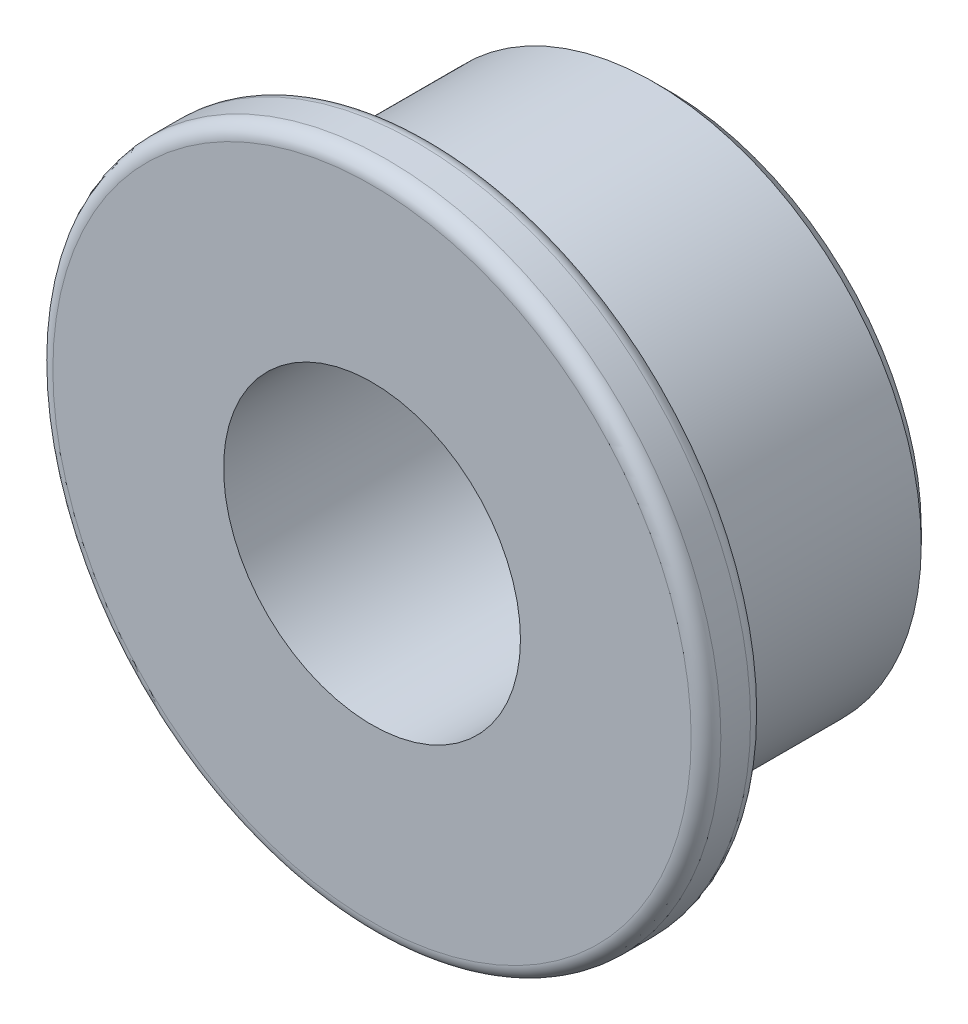
ISO-10303-21;
HEADER;
FILE_DESCRIPTION(('STEP AP214'),'2;1');
FILE_NAME('part.step','',(''),(''),'','','');
FILE_SCHEMA(('AUTOMOTIVE_DESIGN { 1 0 10303 214 1 1 1 1 }'));
ENDSEC;
DATA;
#1=APPLICATION_CONTEXT('core data for automotive mechanical design processes');
#2=APPLICATION_PROTOCOL_DEFINITION('international standard','automotive_design',2000,#1);
#3=PRODUCT_CONTEXT('',#1,'mechanical');
#4=PRODUCT('Part','Part','',(#3));
#5=PRODUCT_RELATED_PRODUCT_CATEGORY('part','',(#4));
#6=PRODUCT_DEFINITION_FORMATION('','',#4);
#7=PRODUCT_DEFINITION_CONTEXT('part definition',#1,'design');
#8=PRODUCT_DEFINITION('design','',#6,#7);
#9=PRODUCT_DEFINITION_SHAPE('','',#8);
#10=(LENGTH_UNIT() NAMED_UNIT(*) SI_UNIT(.MILLI.,.METRE.));
#11=(NAMED_UNIT(*) PLANE_ANGLE_UNIT() SI_UNIT($,.RADIAN.));
#12=(NAMED_UNIT(*) SI_UNIT($,.STERADIAN.) SOLID_ANGLE_UNIT());
#13=UNCERTAINTY_MEASURE_WITH_UNIT(LENGTH_MEASURE(1.E-05),#10,'distance_accuracy_value','');
#14=(GEOMETRIC_REPRESENTATION_CONTEXT(3) GLOBAL_UNCERTAINTY_ASSIGNED_CONTEXT((#13)) GLOBAL_UNIT_ASSIGNED_CONTEXT((#10,
#11,#12)) REPRESENTATION_CONTEXT('',''));
#15=CARTESIAN_POINT('',(0.,0.,0.));
#16=DIRECTION('',(0.,0.,1.));
#17=DIRECTION('',(1.,0.,0.));
#18=AXIS2_PLACEMENT_3D('',#15,#16,#17);
#19=CARTESIAN_POINT('',(0.,0.,-8.));
#20=DIRECTION('',(0.,0.,1.));
#21=DIRECTION('',(1.,0.,0.));
#22=AXIS2_PLACEMENT_3D('',#19,#20,#21);
#23=CYLINDRICAL_SURFACE('',#22,9.);
#24=CARTESIAN_POINT('',(0.,0.,-7.49999999999999));
#25=DIRECTION('',(0.,0.,1.));
#26=DIRECTION('',(1.,0.,0.));
#27=AXIS2_PLACEMENT_3D('',#24,#25,#26);
#28=CIRCLE('',#27,9.);
#29=CARTESIAN_POINT('',(9.,0.,-7.49999999999999));
#30=VERTEX_POINT('',#29);
#31=EDGE_CURVE('E54',#30,#30,#28,.T.);
#32=ORIENTED_EDGE('',*,*,#31,.T.);
#33=EDGE_LOOP('',(#32));
#34=FACE_BOUND('',#33,.T.);
#35=CARTESIAN_POINT('',(0.,0.,-0.8));
#36=DIRECTION('',(0.,0.,1.));
#37=DIRECTION('',(1.,0.,0.));
#38=AXIS2_PLACEMENT_3D('',#35,#36,#37);
#39=CIRCLE('',#38,9.);
#40=CARTESIAN_POINT('',(9.,0.,-0.8));
#41=VERTEX_POINT('',#40);
#42=EDGE_CURVE('E59',#41,#41,#39,.F.);
#43=ORIENTED_EDGE('',*,*,#42,.T.);
#44=EDGE_LOOP('',(#43));
#45=FACE_BOUND('',#44,.T.);
#46=ADVANCED_FACE('F45',(#34,#45),#23,.T.);
#47=CARTESIAN_POINT('',(0.,0.,-8.));
#48=DIRECTION('',(0.,0.,1.));
#49=DIRECTION('',(1.,0.,0.));
#50=AXIS2_PLACEMENT_3D('',#47,#48,#49);
#51=PLANE('',#50);
#52=CARTESIAN_POINT('',(0.,0.,-8.));
#53=DIRECTION('',(0.,0.,1.));
#54=DIRECTION('',(1.,0.,0.));
#55=AXIS2_PLACEMENT_3D('',#52,#53,#54);
#56=CIRCLE('',#55,8.49999999999999);
#57=CARTESIAN_POINT('',(8.49999999999999,0.,-8.));
#58=VERTEX_POINT('',#57);
#59=EDGE_CURVE('E10',#58,#58,#56,.F.);
#60=ORIENTED_EDGE('',*,*,#59,.T.);
#61=EDGE_LOOP('',(#60));
#62=FACE_BOUND('',#61,.T.);
#63=CARTESIAN_POINT('',(0.,0.,-8.));
#64=DIRECTION('',(0.,0.,1.));
#65=DIRECTION('',(1.,0.,0.));
#66=AXIS2_PLACEMENT_3D('',#63,#64,#65);
#67=CIRCLE('',#66,5.);
#68=CARTESIAN_POINT('',(5.,0.,-8.));
#69=VERTEX_POINT('',#68);
#70=EDGE_CURVE('E86',#69,#69,#67,.T.);
#71=ORIENTED_EDGE('',*,*,#70,.T.);
#72=EDGE_LOOP('',(#71));
#73=FACE_BOUND('',#72,.T.);
#74=ADVANCED_FACE('F110',(#62,#73),#51,.F.);
#75=CARTESIAN_POINT('',(0.,0.,-8.));
#76=DIRECTION('',(0.,0.,1.));
#77=DIRECTION('',(1.,0.,0.));
#78=AXIS2_PLACEMENT_3D('',#75,#76,#77);
#79=CYLINDRICAL_SURFACE('',#78,5.);
#80=ORIENTED_EDGE('',*,*,#70,.F.);
#81=EDGE_LOOP('',(#80));
#82=FACE_BOUND('',#81,.T.);
#83=CARTESIAN_POINT('',(0.,0.,2.));
#84=DIRECTION('',(0.,0.,1.));
#85=DIRECTION('',(1.,0.,0.));
#86=AXIS2_PLACEMENT_3D('',#83,#84,#85);
#87=CIRCLE('',#86,5.);
#88=CARTESIAN_POINT('',(5.,0.,2.));
#89=VERTEX_POINT('',#88);
#90=EDGE_CURVE('E90',#89,#89,#87,.T.);
#91=ORIENTED_EDGE('',*,*,#90,.T.);
#92=EDGE_LOOP('',(#91));
#93=FACE_BOUND('',#92,.T.);
#94=ADVANCED_FACE('F95',(#82,#93),#79,.F.);
#95=CARTESIAN_POINT('',(0.,0.,2.));
#96=DIRECTION('',(0.,0.,1.));
#97=DIRECTION('',(1.,0.,0.));
#98=AXIS2_PLACEMENT_3D('',#95,#96,#97);
#99=PLANE('',#98);
#100=CARTESIAN_POINT('',(0.,0.,2.));
#101=DIRECTION('',(0.,0.,1.));
#102=DIRECTION('',(1.,0.,0.));
#103=AXIS2_PLACEMENT_3D('',#100,#101,#102);
#104=CIRCLE('',#103,10.75);
#105=CARTESIAN_POINT('',(10.75,0.,2.));
#106=VERTEX_POINT('',#105);
#107=EDGE_CURVE('E82',#106,#106,#104,.T.);
#108=ORIENTED_EDGE('',*,*,#107,.T.);
#109=EDGE_LOOP('',(#108));
#110=FACE_BOUND('',#109,.T.);
#111=ORIENTED_EDGE('',*,*,#90,.F.);
#112=EDGE_LOOP('',(#111));
#113=FACE_BOUND('',#112,.T.);
#114=ADVANCED_FACE('F97',(#110,#113),#99,.T.);
#115=CARTESIAN_POINT('',(0.,0.,0.));
#116=DIRECTION('',(0.,0.,1.));
#117=DIRECTION('',(1.,0.,0.));
#118=AXIS2_PLACEMENT_3D('',#115,#116,#117);
#119=PLANE('',#118);
#120=CARTESIAN_POINT('',(0.,0.,0.));
#121=DIRECTION('',(0.,0.,1.));
#122=DIRECTION('',(1.,0.,0.));
#123=AXIS2_PLACEMENT_3D('',#120,#121,#122);
#124=CIRCLE('',#123,9.8);
#125=CARTESIAN_POINT('',(9.8,0.,0.));
#126=VERTEX_POINT('',#125);
#127=EDGE_CURVE('E64',#126,#126,#124,.T.);
#128=ORIENTED_EDGE('',*,*,#127,.T.);
#129=EDGE_LOOP('',(#128));
#130=FACE_BOUND('',#129,.T.);
#131=CARTESIAN_POINT('',(0.,0.,0.));
#132=DIRECTION('',(0.,0.,1.));
#133=DIRECTION('',(1.,0.,0.));
#134=AXIS2_PLACEMENT_3D('',#131,#132,#133);
#135=CIRCLE('',#134,10.75);
#136=CARTESIAN_POINT('',(10.75,0.,0.));
#137=VERTEX_POINT('',#136);
#138=EDGE_CURVE('E70',#137,#137,#135,.F.);
#139=ORIENTED_EDGE('',*,*,#138,.T.);
#140=EDGE_LOOP('',(#139));
#141=FACE_BOUND('',#140,.T.);
#142=ADVANCED_FACE('F99',(#130,#141),#119,.F.);
#143=CARTESIAN_POINT('',(0.,0.,2.));
#144=DIRECTION('',(0.,0.,-1.));
#145=DIRECTION('',(-1.,0.,0.));
#146=AXIS2_PLACEMENT_3D('',#143,#144,#145);
#147=CYLINDRICAL_SURFACE('',#146,11.25);
#148=CARTESIAN_POINT('',(0.,0.,0.5));
#149=DIRECTION('',(0.,0.,1.));
#150=DIRECTION('',(1.,0.,0.));
#151=AXIS2_PLACEMENT_3D('',#148,#149,#150);
#152=CIRCLE('',#151,11.25);
#153=CARTESIAN_POINT('',(11.25,0.,0.5));
#154=VERTEX_POINT('',#153);
#155=EDGE_CURVE('E74',#154,#154,#152,.T.);
#156=ORIENTED_EDGE('',*,*,#155,.T.);
#157=EDGE_LOOP('',(#156));
#158=FACE_BOUND('',#157,.T.);
#159=CARTESIAN_POINT('',(0.,0.,1.5));
#160=DIRECTION('',(0.,0.,1.));
#161=DIRECTION('',(1.,0.,0.));
#162=AXIS2_PLACEMENT_3D('',#159,#160,#161);
#163=CIRCLE('',#162,11.25);
#164=CARTESIAN_POINT('',(11.25,0.,1.5));
#165=VERTEX_POINT('',#164);
#166=EDGE_CURVE('E78',#165,#165,#163,.F.);
#167=ORIENTED_EDGE('',*,*,#166,.T.);
#168=EDGE_LOOP('',(#167));
#169=FACE_BOUND('',#168,.T.);
#170=ADVANCED_FACE('F107',(#158,#169),#147,.T.);
#171=CARTESIAN_POINT('',(0.,0.,1.5));
#172=DIRECTION('',(0.,0.,1.));
#173=DIRECTION('',(1.,0.,0.));
#174=AXIS2_PLACEMENT_3D('',#171,#172,#173);
#175=TOROIDAL_SURFACE('',#174,10.75,0.5);
#176=ORIENTED_EDGE('',*,*,#166,.F.);
#177=EDGE_LOOP('',(#176));
#178=FACE_BOUND('',#177,.T.);
#179=ORIENTED_EDGE('',*,*,#107,.F.);
#180=EDGE_LOOP('',(#179));
#181=FACE_BOUND('',#180,.T.);
#182=ADVANCED_FACE('F122',(#178,#181),#175,.T.);
#183=CARTESIAN_POINT('',(0.,0.,0.5));
#184=DIRECTION('',(0.,0.,1.));
#185=DIRECTION('',(1.,0.,0.));
#186=AXIS2_PLACEMENT_3D('',#183,#184,#185);
#187=TOROIDAL_SURFACE('',#186,10.75,0.5);
#188=ORIENTED_EDGE('',*,*,#138,.F.);
#189=EDGE_LOOP('',(#188));
#190=FACE_BOUND('',#189,.T.);
#191=ORIENTED_EDGE('',*,*,#155,.F.);
#192=EDGE_LOOP('',(#191));
#193=FACE_BOUND('',#192,.T.);
#194=ADVANCED_FACE('F124',(#190,#193),#187,.T.);
#195=CARTESIAN_POINT('',(0.,0.,-0.8));
#196=DIRECTION('',(0.,0.,1.));
#197=DIRECTION('',(1.,0.,0.));
#198=AXIS2_PLACEMENT_3D('',#195,#196,#197);
#199=TOROIDAL_SURFACE('',#198,9.8,0.8);
#200=ORIENTED_EDGE('',*,*,#42,.F.);
#201=EDGE_LOOP('',(#200));
#202=FACE_BOUND('',#201,.T.);
#203=ORIENTED_EDGE('',*,*,#127,.F.);
#204=EDGE_LOOP('',(#203));
#205=FACE_BOUND('',#204,.T.);
#206=ADVANCED_FACE('F127',(#202,#205),#199,.F.);
#207=CARTESIAN_POINT('',(0.,0.,-7.49999999999999));
#208=DIRECTION('',(0.,0.,1.));
#209=DIRECTION('',(1.,0.,0.));
#210=AXIS2_PLACEMENT_3D('',#207,#208,#209);
#211=CONICAL_SURFACE('',#210,9.,0.78539816339745);
#212=ORIENTED_EDGE('',*,*,#59,.F.);
#213=EDGE_LOOP('',(#212));
#214=FACE_BOUND('',#213,.T.);
#215=ORIENTED_EDGE('',*,*,#31,.F.);
#216=EDGE_LOOP('',(#215));
#217=FACE_BOUND('',#216,.T.);
#218=ADVANCED_FACE('F48',(#214,#217),#211,.T.);
#219=CLOSED_SHELL('',(#46,#74,#94,#114,#142,#170,#182,#194,#206,#218));
#220=MANIFOLD_SOLID_BREP('B2',#219);
#221=ADVANCED_BREP_SHAPE_REPRESENTATION('',(#18,#220),#14);
#222=SHAPE_DEFINITION_REPRESENTATION(#9,#221);
ENDSEC;
END-ISO-10303-21;
